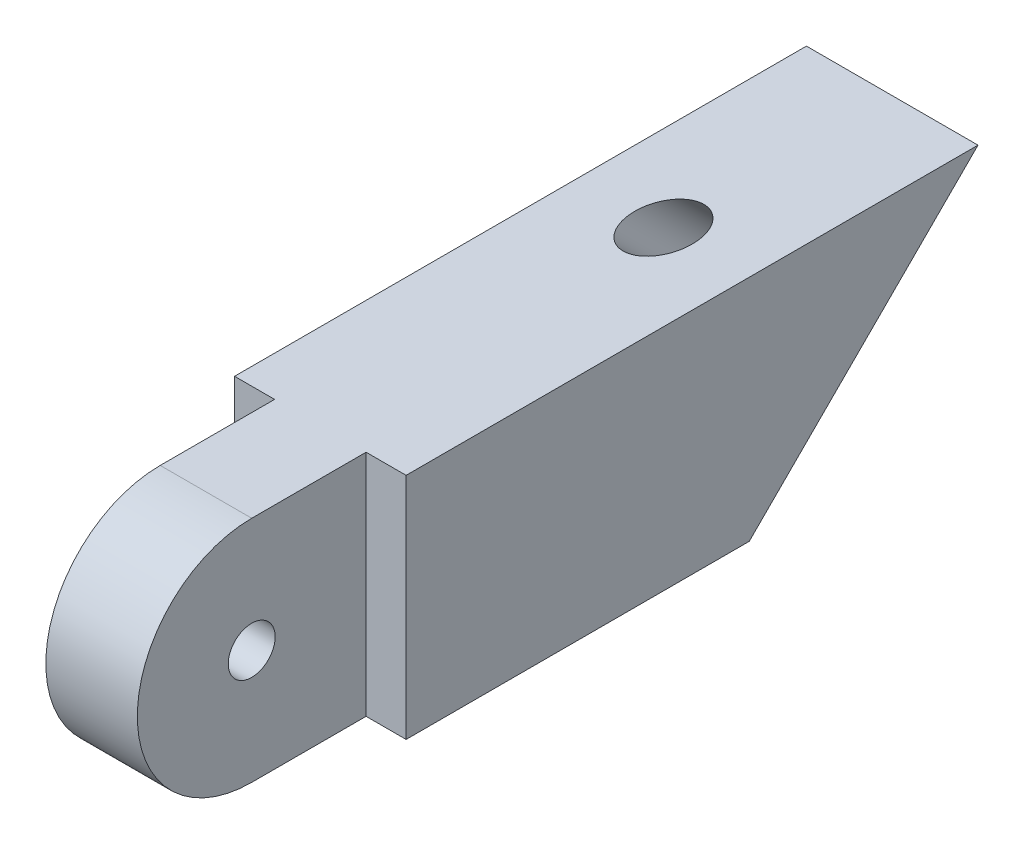
ISO-10303-21;
HEADER;
FILE_DESCRIPTION(('STEP AP214'),'2;1');
FILE_NAME('part.step','',(''),(''),'','','');
FILE_SCHEMA(('AUTOMOTIVE_DESIGN { 1 0 10303 214 1 1 1 1 }'));
ENDSEC;
DATA;
#1=APPLICATION_CONTEXT('core data for automotive mechanical design processes');
#2=APPLICATION_PROTOCOL_DEFINITION('international standard','automotive_design',2000,#1);
#3=PRODUCT_CONTEXT('',#1,'mechanical');
#4=PRODUCT('Part','Part','',(#3));
#5=PRODUCT_RELATED_PRODUCT_CATEGORY('part','',(#4));
#6=PRODUCT_DEFINITION_FORMATION('','',#4);
#7=PRODUCT_DEFINITION_CONTEXT('part definition',#1,'design');
#8=PRODUCT_DEFINITION('design','',#6,#7);
#9=PRODUCT_DEFINITION_SHAPE('','',#8);
#10=(LENGTH_UNIT() NAMED_UNIT(*) SI_UNIT(.MILLI.,.METRE.));
#11=(NAMED_UNIT(*) PLANE_ANGLE_UNIT() SI_UNIT($,.RADIAN.));
#12=(NAMED_UNIT(*) SI_UNIT($,.STERADIAN.) SOLID_ANGLE_UNIT());
#13=UNCERTAINTY_MEASURE_WITH_UNIT(LENGTH_MEASURE(1.E-05),#10,'distance_accuracy_value','');
#14=(GEOMETRIC_REPRESENTATION_CONTEXT(3) GLOBAL_UNCERTAINTY_ASSIGNED_CONTEXT((#13)) GLOBAL_UNIT_ASSIGNED_CONTEXT((#10,
#11,#12)) REPRESENTATION_CONTEXT('',''));
#15=CARTESIAN_POINT('',(0.,0.,0.));
#16=DIRECTION('',(0.,0.,1.));
#17=DIRECTION('',(1.,0.,0.));
#18=AXIS2_PLACEMENT_3D('',#15,#16,#17);
#19=CARTESIAN_POINT('',(30.,20.,70.));
#20=DIRECTION('',(0.,-1.,0.));
#21=DIRECTION('',(0.,0.,-1.));
#22=AXIS2_PLACEMENT_3D('',#19,#20,#21);
#23=PLANE('',#22);
#24=CARTESIAN_POINT('',(15.,20.,-30.));
#25=DIRECTION('',(0.,-1.,0.));
#26=DIRECTION('',(0.,0.,-1.));
#27=AXIS2_PLACEMENT_3D('',#24,#25,#26);
#28=ELLIPSE('',#27,7.07106781186544,5.);
#29=CARTESIAN_POINT('',(15.,20.,-37.0710678118654));
#30=VERTEX_POINT('',#29);
#31=EDGE_CURVE('E38',#30,#30,#28,.T.);
#32=ORIENTED_EDGE('',*,*,#31,.T.);
#33=EDGE_LOOP('',(#32));
#34=FACE_BOUND('',#33,.T.);
#35=DIRECTION('',(1.,0.,0.));
#36=VECTOR('',#35,1.);
#37=CARTESIAN_POINT('',(-22.,20.,50.));
#38=LINE('',#37,#36);
#39=CARTESIAN_POINT('',(6.99999999999999,20.,50.));
#40=VERTEX_POINT('',#39);
#41=CARTESIAN_POINT('',(23.,20.,50.));
#42=VERTEX_POINT('',#41);
#43=EDGE_CURVE('E159',#40,#42,#38,.T.);
#44=ORIENTED_EDGE('',*,*,#43,.T.);
#45=DIRECTION('',(0.,0.,1.));
#46=VECTOR('',#45,1.);
#47=CARTESIAN_POINT('',(23.,20.,30.));
#48=LINE('',#47,#46);
#49=CARTESIAN_POINT('',(23.,20.,30.));
#50=VERTEX_POINT('',#49);
#51=EDGE_CURVE('E127',#50,#42,#48,.T.);
#52=ORIENTED_EDGE('',*,*,#51,.F.);
#53=DIRECTION('',(-1.,0.,0.));
#54=VECTOR('',#53,1.);
#55=CARTESIAN_POINT('',(30.,20.,30.));
#56=LINE('',#55,#54);
#57=CARTESIAN_POINT('',(30.,20.,30.));
#58=VERTEX_POINT('',#57);
#59=EDGE_CURVE('E119',#58,#50,#56,.T.);
#60=ORIENTED_EDGE('',*,*,#59,.F.);
#61=DIRECTION('',(0.,0.,1.));
#62=VECTOR('',#61,1.);
#63=CARTESIAN_POINT('',(30.,20.,70.));
#64=LINE('',#63,#62);
#65=CARTESIAN_POINT('',(30.,20.,-70.));
#66=VERTEX_POINT('',#65);
#67=EDGE_CURVE('E111',#66,#58,#64,.T.);
#68=ORIENTED_EDGE('',*,*,#67,.F.);
#69=DIRECTION('',(-1.,0.,0.));
#70=VECTOR('',#69,1.);
#71=CARTESIAN_POINT('',(30.,20.,-70.));
#72=LINE('',#71,#70);
#73=CARTESIAN_POINT('',(0.,20.,-70.));
#74=VERTEX_POINT('',#73);
#75=EDGE_CURVE('E43',#66,#74,#72,.T.);
#76=ORIENTED_EDGE('',*,*,#75,.T.);
#77=DIRECTION('',(0.,0.,1.));
#78=VECTOR('',#77,1.);
#79=CARTESIAN_POINT('',(0.,20.,70.));
#80=LINE('',#79,#78);
#81=CARTESIAN_POINT('',(0.,20.,30.));
#82=VERTEX_POINT('',#81);
#83=EDGE_CURVE('E124',#74,#82,#80,.T.);
#84=ORIENTED_EDGE('',*,*,#83,.T.);
#85=DIRECTION('',(-1.,0.,0.));
#86=VECTOR('',#85,1.);
#87=CARTESIAN_POINT('',(0.,20.,30.));
#88=LINE('',#87,#86);
#89=CARTESIAN_POINT('',(7.,20.,30.));
#90=VERTEX_POINT('',#89);
#91=EDGE_CURVE('E136',#90,#82,#88,.T.);
#92=ORIENTED_EDGE('',*,*,#91,.F.);
#93=DIRECTION('',(0.,0.,1.));
#94=VECTOR('',#93,1.);
#95=CARTESIAN_POINT('',(7.,20.,30.));
#96=LINE('',#95,#94);
#97=EDGE_CURVE('E130',#90,#40,#96,.T.);
#98=ORIENTED_EDGE('',*,*,#97,.T.);
#99=EDGE_LOOP('',(#44,#52,#60,#68,#76,#84,#92,#98));
#100=FACE_BOUND('',#99,.T.);
#101=ADVANCED_FACE('F35',(#34,#100),#23,.F.);
#102=CARTESIAN_POINT('',(30.,0.,0.));
#103=DIRECTION('',(1.,0.,0.));
#104=DIRECTION('',(0.,0.,-1.));
#105=AXIS2_PLACEMENT_3D('',#102,#103,#104);
#106=PLANE('',#105);
#107=DIRECTION('',(0.,-0.707106781186544,0.707106781186551));
#108=VECTOR('',#107,1.);
#109=CARTESIAN_POINT('',(30.,20.,-70.));
#110=LINE('',#109,#108);
#111=CARTESIAN_POINT('',(30.,-20.,-29.9999999999996));
#112=VERTEX_POINT('',#111);
#113=EDGE_CURVE('E100',#66,#112,#110,.T.);
#114=ORIENTED_EDGE('',*,*,#113,.F.);
#115=ORIENTED_EDGE('',*,*,#67,.T.);
#116=DIRECTION('',(0.,1.,0.));
#117=VECTOR('',#116,1.);
#118=CARTESIAN_POINT('',(30.,-20.,30.));
#119=LINE('',#118,#117);
#120=CARTESIAN_POINT('',(30.,-20.,30.));
#121=VERTEX_POINT('',#120);
#122=EDGE_CURVE('E141',#121,#58,#119,.T.);
#123=ORIENTED_EDGE('',*,*,#122,.F.);
#124=DIRECTION('',(0.,0.,-1.));
#125=VECTOR('',#124,1.);
#126=CARTESIAN_POINT('',(30.,-20.,70.));
#127=LINE('',#126,#125);
#128=EDGE_CURVE('E105',#121,#112,#127,.T.);
#129=ORIENTED_EDGE('',*,*,#128,.T.);
#130=EDGE_LOOP('',(#114,#115,#123,#129));
#131=FACE_BOUND('',#130,.T.);
#132=ADVANCED_FACE('F110',(#131),#106,.T.);
#133=CARTESIAN_POINT('',(30.,-20.,70.));
#134=DIRECTION('',(0.,1.,0.));
#135=DIRECTION('',(0.,0.,1.));
#136=AXIS2_PLACEMENT_3D('',#133,#134,#135);
#137=PLANE('',#136);
#138=DIRECTION('',(0.,0.,-1.));
#139=VECTOR('',#138,1.);
#140=CARTESIAN_POINT('',(0.,-20.,70.));
#141=LINE('',#140,#139);
#142=CARTESIAN_POINT('',(0.,-20.,30.));
#143=VERTEX_POINT('',#142);
#144=CARTESIAN_POINT('',(0.,-20.,-29.9999999999996));
#145=VERTEX_POINT('',#144);
#146=EDGE_CURVE('E120',#143,#145,#141,.T.);
#147=ORIENTED_EDGE('',*,*,#146,.T.);
#148=DIRECTION('',(1.,0.,0.));
#149=VECTOR('',#148,1.);
#150=CARTESIAN_POINT('',(-15.,-20.,-29.9999999999996));
#151=LINE('',#150,#149);
#152=EDGE_CURVE('E50',#145,#112,#151,.T.);
#153=ORIENTED_EDGE('',*,*,#152,.T.);
#154=ORIENTED_EDGE('',*,*,#128,.F.);
#155=DIRECTION('',(1.,0.,0.));
#156=VECTOR('',#155,1.);
#157=CARTESIAN_POINT('',(23.,-20.,30.));
#158=LINE('',#157,#156);
#159=CARTESIAN_POINT('',(23.,-20.,30.));
#160=VERTEX_POINT('',#159);
#161=EDGE_CURVE('E57',#160,#121,#158,.T.);
#162=ORIENTED_EDGE('',*,*,#161,.F.);
#163=DIRECTION('',(0.,0.,1.));
#164=VECTOR('',#163,1.);
#165=CARTESIAN_POINT('',(23.,-20.,30.));
#166=LINE('',#165,#164);
#167=CARTESIAN_POINT('',(23.,-20.,50.));
#168=VERTEX_POINT('',#167);
#169=EDGE_CURVE('E147',#160,#168,#166,.T.);
#170=ORIENTED_EDGE('',*,*,#169,.T.);
#171=DIRECTION('',(1.,0.,0.));
#172=VECTOR('',#171,1.);
#173=CARTESIAN_POINT('',(-22.,-20.,50.));
#174=LINE('',#173,#172);
#175=CARTESIAN_POINT('',(7.,-20.,50.));
#176=VERTEX_POINT('',#175);
#177=EDGE_CURVE('E164',#176,#168,#174,.T.);
#178=ORIENTED_EDGE('',*,*,#177,.F.);
#179=DIRECTION('',(0.,0.,1.));
#180=VECTOR('',#179,1.);
#181=CARTESIAN_POINT('',(7.,-20.,30.));
#182=LINE('',#181,#180);
#183=CARTESIAN_POINT('',(7.,-20.,30.));
#184=VERTEX_POINT('',#183);
#185=EDGE_CURVE('E133',#184,#176,#182,.T.);
#186=ORIENTED_EDGE('',*,*,#185,.F.);
#187=DIRECTION('',(1.,0.,0.));
#188=VECTOR('',#187,1.);
#189=CARTESIAN_POINT('',(7.,-20.,30.));
#190=LINE('',#189,#188);
#191=EDGE_CURVE('E152',#143,#184,#190,.T.);
#192=ORIENTED_EDGE('',*,*,#191,.F.);
#193=EDGE_LOOP('',(#147,#153,#154,#162,#170,#178,#186,#192));
#194=FACE_BOUND('',#193,.T.);
#195=ADVANCED_FACE('F178',(#194),#137,.F.);
#196=CARTESIAN_POINT('',(0.,0.,0.));
#197=DIRECTION('',(1.,0.,0.));
#198=DIRECTION('',(0.,0.,-1.));
#199=AXIS2_PLACEMENT_3D('',#196,#197,#198);
#200=PLANE('',#199);
#201=ORIENTED_EDGE('',*,*,#83,.F.);
#202=DIRECTION('',(0.,-0.707106781186544,0.707106781186551));
#203=VECTOR('',#202,1.);
#204=CARTESIAN_POINT('',(0.,-24.9999999999999,-24.9999999999996));
#205=LINE('',#204,#203);
#206=EDGE_CURVE('E11',#74,#145,#205,.T.);
#207=ORIENTED_EDGE('',*,*,#206,.T.);
#208=ORIENTED_EDGE('',*,*,#146,.F.);
#209=DIRECTION('',(0.,-1.,0.));
#210=VECTOR('',#209,1.);
#211=CARTESIAN_POINT('',(0.,-20.,30.));
#212=LINE('',#211,#210);
#213=EDGE_CURVE('E149',#82,#143,#212,.T.);
#214=ORIENTED_EDGE('',*,*,#213,.F.);
#215=EDGE_LOOP('',(#201,#207,#208,#214));
#216=FACE_BOUND('',#215,.T.);
#217=ADVANCED_FACE('F177',(#216),#200,.F.);
#218=CARTESIAN_POINT('',(7.,20.,30.));
#219=DIRECTION('',(1.,0.,0.));
#220=DIRECTION('',(0.,1.,0.));
#221=AXIS2_PLACEMENT_3D('',#218,#219,#220);
#222=PLANE('',#221);
#223=CARTESIAN_POINT('',(7.,0.,50.));
#224=DIRECTION('',(1.,0.,0.));
#225=DIRECTION('',(0.,1.,0.));
#226=AXIS2_PLACEMENT_3D('',#223,#224,#225);
#227=CIRCLE('',#226,4.1);
#228=CARTESIAN_POINT('',(7.,4.1,50.));
#229=VERTEX_POINT('',#228);
#230=EDGE_CURVE('E183',#229,#229,#227,.T.);
#231=ORIENTED_EDGE('',*,*,#230,.T.);
#232=EDGE_LOOP('',(#231));
#233=FACE_BOUND('',#232,.T.);
#234=ORIENTED_EDGE('',*,*,#185,.T.);
#235=CARTESIAN_POINT('',(7.,0.,50.));
#236=DIRECTION('',(1.,0.,0.));
#237=DIRECTION('',(0.,1.,0.));
#238=AXIS2_PLACEMENT_3D('',#235,#236,#237);
#239=CIRCLE('',#238,20.);
#240=EDGE_CURVE('E143',#176,#40,#239,.F.);
#241=ORIENTED_EDGE('',*,*,#240,.T.);
#242=ORIENTED_EDGE('',*,*,#97,.F.);
#243=DIRECTION('',(0.,1.,0.));
#244=VECTOR('',#243,1.);
#245=CARTESIAN_POINT('',(7.,20.,30.));
#246=LINE('',#245,#244);
#247=EDGE_CURVE('E169',#184,#90,#246,.T.);
#248=ORIENTED_EDGE('',*,*,#247,.F.);
#249=EDGE_LOOP('',(#234,#241,#242,#248));
#250=FACE_BOUND('',#249,.T.);
#251=ADVANCED_FACE('F181',(#233,#250),#222,.F.);
#252=CARTESIAN_POINT('',(0.,0.,30.));
#253=DIRECTION('',(0.,0.,-1.));
#254=DIRECTION('',(-1.,0.,0.));
#255=AXIS2_PLACEMENT_3D('',#252,#253,#254);
#256=PLANE('',#255);
#257=ORIENTED_EDGE('',*,*,#213,.T.);
#258=ORIENTED_EDGE('',*,*,#191,.T.);
#259=ORIENTED_EDGE('',*,*,#247,.T.);
#260=ORIENTED_EDGE('',*,*,#91,.T.);
#261=EDGE_LOOP('',(#257,#258,#259,#260));
#262=FACE_BOUND('',#261,.T.);
#263=ADVANCED_FACE('F173',(#262),#256,.F.);
#264=CARTESIAN_POINT('',(23.,20.,30.));
#265=DIRECTION('',(-1.,0.,0.));
#266=DIRECTION('',(0.,-1.,0.));
#267=AXIS2_PLACEMENT_3D('',#264,#265,#266);
#268=PLANE('',#267);
#269=CARTESIAN_POINT('',(23.,0.,50.));
#270=DIRECTION('',(1.,0.,0.));
#271=DIRECTION('',(0.,1.,0.));
#272=AXIS2_PLACEMENT_3D('',#269,#270,#271);
#273=CIRCLE('',#272,4.1);
#274=CARTESIAN_POINT('',(23.,4.1,50.));
#275=VERTEX_POINT('',#274);
#276=EDGE_CURVE('E185',#275,#275,#273,.T.);
#277=ORIENTED_EDGE('',*,*,#276,.F.);
#278=EDGE_LOOP('',(#277));
#279=FACE_BOUND('',#278,.T.);
#280=CARTESIAN_POINT('',(23.,0.,50.));
#281=DIRECTION('',(-1.,0.,0.));
#282=DIRECTION('',(0.,-1.,0.));
#283=AXIS2_PLACEMENT_3D('',#280,#281,#282);
#284=CIRCLE('',#283,20.);
#285=EDGE_CURVE('E157',#168,#42,#284,.T.);
#286=ORIENTED_EDGE('',*,*,#285,.F.);
#287=ORIENTED_EDGE('',*,*,#169,.F.);
#288=DIRECTION('',(0.,-1.,0.));
#289=VECTOR('',#288,1.);
#290=CARTESIAN_POINT('',(23.,20.,30.));
#291=LINE('',#290,#289);
#292=EDGE_CURVE('E145',#50,#160,#291,.T.);
#293=ORIENTED_EDGE('',*,*,#292,.F.);
#294=ORIENTED_EDGE('',*,*,#51,.T.);
#295=EDGE_LOOP('',(#286,#287,#293,#294));
#296=FACE_BOUND('',#295,.T.);
#297=ADVANCED_FACE('F156',(#279,#296),#268,.F.);
#298=CARTESIAN_POINT('',(0.,0.,30.));
#299=DIRECTION('',(0.,0.,1.));
#300=DIRECTION('',(1.,0.,0.));
#301=AXIS2_PLACEMENT_3D('',#298,#299,#300);
#302=PLANE('',#301);
#303=ORIENTED_EDGE('',*,*,#122,.T.);
#304=ORIENTED_EDGE('',*,*,#59,.T.);
#305=ORIENTED_EDGE('',*,*,#292,.T.);
#306=ORIENTED_EDGE('',*,*,#161,.T.);
#307=EDGE_LOOP('',(#303,#304,#305,#306));
#308=FACE_BOUND('',#307,.T.);
#309=ADVANCED_FACE('F236',(#308),#302,.T.);
#310=CARTESIAN_POINT('',(-22.,0.,50.));
#311=DIRECTION('',(1.,0.,0.));
#312=DIRECTION('',(0.,1.,0.));
#313=AXIS2_PLACEMENT_3D('',#310,#311,#312);
#314=CYLINDRICAL_SURFACE('',#313,20.);
#315=ORIENTED_EDGE('',*,*,#240,.F.);
#316=ORIENTED_EDGE('',*,*,#177,.T.);
#317=ORIENTED_EDGE('',*,*,#285,.T.);
#318=ORIENTED_EDGE('',*,*,#43,.F.);
#319=EDGE_LOOP('',(#315,#316,#317,#318));
#320=FACE_BOUND('',#319,.T.);
#321=ADVANCED_FACE('F182',(#320),#314,.T.);
#322=CARTESIAN_POINT('',(-22.,0.,50.));
#323=DIRECTION('',(1.,0.,0.));
#324=DIRECTION('',(0.,1.,0.));
#325=AXIS2_PLACEMENT_3D('',#322,#323,#324);
#326=CYLINDRICAL_SURFACE('',#325,4.1);
#327=CARTESIAN_POINT('',(23.,4.1,50.));
#328=CARTESIAN_POINT('',(22.8333333333333,4.1,50.));
#329=CARTESIAN_POINT('',(22.6666666666667,4.1,50.));
#330=CARTESIAN_POINT('',(22.3333333333333,4.1,50.));
#331=CARTESIAN_POINT('',(22.1666666666667,4.1,50.));
#332=CARTESIAN_POINT('',(21.8333333333333,4.1,50.));
#333=CARTESIAN_POINT('',(21.6666666666667,4.1,50.));
#334=CARTESIAN_POINT('',(21.3333333333333,4.1,50.));
#335=CARTESIAN_POINT('',(21.1666666666667,4.1,50.));
#336=CARTESIAN_POINT('',(20.8333333333333,4.1,50.));
#337=CARTESIAN_POINT('',(20.6666666666667,4.1,50.));
#338=CARTESIAN_POINT('',(20.3333333333333,4.1,50.));
#339=CARTESIAN_POINT('',(20.1666666666667,4.1,50.));
#340=CARTESIAN_POINT('',(19.8333333333333,4.1,50.));
#341=CARTESIAN_POINT('',(19.6666666666667,4.1,50.));
#342=CARTESIAN_POINT('',(19.3333333333333,4.1,50.));
#343=CARTESIAN_POINT('',(19.1666666666667,4.1,50.));
#344=CARTESIAN_POINT('',(18.8333333333333,4.1,50.));
#345=CARTESIAN_POINT('',(18.6666666666667,4.1,50.));
#346=CARTESIAN_POINT('',(18.3333333333333,4.1,50.));
#347=CARTESIAN_POINT('',(18.1666666666667,4.1,50.));
#348=CARTESIAN_POINT('',(17.8333333333333,4.1,50.));
#349=CARTESIAN_POINT('',(17.6666666666667,4.1,50.));
#350=CARTESIAN_POINT('',(17.3333333333333,4.1,50.));
#351=CARTESIAN_POINT('',(17.1666666666667,4.1,50.));
#352=CARTESIAN_POINT('',(16.8333333333333,4.1,50.));
#353=CARTESIAN_POINT('',(16.6666666666667,4.1,50.));
#354=CARTESIAN_POINT('',(16.3333333333333,4.1,50.));
#355=CARTESIAN_POINT('',(16.1666666666667,4.1,50.));
#356=CARTESIAN_POINT('',(15.8333333333333,4.1,50.));
#357=CARTESIAN_POINT('',(15.6666666666667,4.1,50.));
#358=CARTESIAN_POINT('',(15.3333333333333,4.1,50.));
#359=CARTESIAN_POINT('',(15.1666666666667,4.1,50.));
#360=CARTESIAN_POINT('',(14.8333333333333,4.1,50.));
#361=CARTESIAN_POINT('',(14.6666666666667,4.1,50.));
#362=CARTESIAN_POINT('',(14.3333333333333,4.1,50.));
#363=CARTESIAN_POINT('',(14.1666666666667,4.1,50.));
#364=CARTESIAN_POINT('',(13.8333333333333,4.1,50.));
#365=CARTESIAN_POINT('',(13.6666666666667,4.1,50.));
#366=CARTESIAN_POINT('',(13.3333333333333,4.1,50.));
#367=CARTESIAN_POINT('',(13.1666666666667,4.1,50.));
#368=CARTESIAN_POINT('',(12.8333333333333,4.1,50.));
#369=CARTESIAN_POINT('',(12.6666666666667,4.1,50.));
#370=CARTESIAN_POINT('',(12.3333333333333,4.1,50.));
#371=CARTESIAN_POINT('',(12.1666666666667,4.1,50.));
#372=CARTESIAN_POINT('',(11.8333333333333,4.1,50.));
#373=CARTESIAN_POINT('',(11.6666666666667,4.1,50.));
#374=CARTESIAN_POINT('',(11.3333333333333,4.1,50.));
#375=CARTESIAN_POINT('',(11.1666666666667,4.1,50.));
#376=CARTESIAN_POINT('',(10.8333333333333,4.1,50.));
#377=CARTESIAN_POINT('',(10.6666666666667,4.1,50.));
#378=CARTESIAN_POINT('',(10.3333333333333,4.1,50.));
#379=CARTESIAN_POINT('',(10.1666666666667,4.1,50.));
#380=CARTESIAN_POINT('',(9.83333333333333,4.1,50.));
#381=CARTESIAN_POINT('',(9.66666666666667,4.1,50.));
#382=CARTESIAN_POINT('',(9.33333333333333,4.1,50.));
#383=CARTESIAN_POINT('',(9.16666666666667,4.1,50.));
#384=CARTESIAN_POINT('',(8.83333333333333,4.1,50.));
#385=CARTESIAN_POINT('',(8.66666666666667,4.1,50.));
#386=CARTESIAN_POINT('',(8.33333333333333,4.1,50.));
#387=CARTESIAN_POINT('',(8.16666666666667,4.1,50.));
#388=CARTESIAN_POINT('',(7.83333333333333,4.1,50.));
#389=CARTESIAN_POINT('',(7.66666666666667,4.1,50.));
#390=CARTESIAN_POINT('',(7.33333333333333,4.1,50.));
#391=CARTESIAN_POINT('',(7.16666666666667,4.1,50.));
#392=CARTESIAN_POINT('',(7.,4.1,50.));
#393=B_SPLINE_CURVE_WITH_KNOTS('',3,(#327,#328,#329,#330,#331,#332,#333,#334,#335,#336,#337,
#338,#339,#340,#341,#342,#343,#344,#345,#346,#347,#348,#349,#350,#351,#352,#353,#354,#355,#356,
#357,#358,#359,#360,#361,#362,#363,#364,#365,#366,#367,#368,#369,#370,#371,#372,#373,#374,#375,
#376,#377,#378,#379,#380,#381,#382,#383,#384,#385,#386,#387,#388,#389,#390,#391,#392),
.UNSPECIFIED.,.F.,.F.,(4,2,2,2,2,2,2,2,2,2,2,2,2,2,2,2,2,2,2,2,2,2,2,2,2,2,2,2,2,2,2,2,4),(0.,
0.5,1.,1.5,2.,2.5,3.,3.5,4.,4.5,5.,5.50000000000001,6.00000000000001,6.50000000000001,
7.00000000000001,7.50000000000001,8.00000000000001,8.50000000000001,9.00000000000001,
9.50000000000001,10.,10.5,11.,11.5,12.,12.5,13.,13.5,14.,14.5,15.,15.5,16.),.UNSPECIFIED.);
#394=EDGE_CURVE('BSEAM242',#275,#229,#393,.T.);
#395=ORIENTED_EDGE('',*,*,#276,.T.);
#396=ORIENTED_EDGE('',*,*,#230,.F.);
#397=ORIENTED_EDGE('',*,*,#394,.T.);
#398=ORIENTED_EDGE('',*,*,#394,.F.);
#399=EDGE_LOOP('',(#395,#397,#396,#398));
#400=FACE_BOUND('',#399,.T.);
#401=ADVANCED_FACE('F242',(#400),#326,.F.);
#402=CARTESIAN_POINT('',(-15.,20.,-70.));
#403=DIRECTION('',(0.,0.707106781186551,0.707106781186544));
#404=DIRECTION('',(0.,-0.707106781186544,0.707106781186551));
#405=AXIS2_PLACEMENT_3D('',#402,#403,#404);
#406=PLANE('',#405);
#407=CARTESIAN_POINT('',(15.,0.,-49.9999999999998));
#408=DIRECTION('',(0.,-0.707106781186551,-0.707106781186544));
#409=DIRECTION('',(0.,0.707106781186544,-0.707106781186551));
#410=AXIS2_PLACEMENT_3D('',#407,#408,#409);
#411=CIRCLE('',#410,10.);
#412=CARTESIAN_POINT('',(15.,7.07106781186544,-57.0710678118653));
#413=VERTEX_POINT('',#412);
#414=EDGE_CURVE('E191',#413,#413,#411,.T.);
#415=ORIENTED_EDGE('',*,*,#414,.F.);
#416=EDGE_LOOP('',(#415));
#417=FACE_BOUND('',#416,.T.);
#418=ORIENTED_EDGE('',*,*,#75,.F.);
#419=ORIENTED_EDGE('',*,*,#113,.T.);
#420=ORIENTED_EDGE('',*,*,#152,.F.);
#421=ORIENTED_EDGE('',*,*,#206,.F.);
#422=EDGE_LOOP('',(#418,#419,#420,#421));
#423=FACE_BOUND('',#422,.T.);
#424=ADVANCED_FACE('F99',(#417,#423),#406,.F.);
#425=CARTESIAN_POINT('',(15.,7.07106781186551,-42.9289321881343));
#426=DIRECTION('',(0.,-0.707106781186551,-0.707106781186544));
#427=DIRECTION('',(0.,0.707106781186544,-0.707106781186551));
#428=AXIS2_PLACEMENT_3D('',#425,#426,#427);
#429=CYLINDRICAL_SURFACE('',#428,10.);
#430=CARTESIAN_POINT('',(15.,7.07106781186551,-42.9289321881343));
#431=DIRECTION('',(0.,-0.707106781186551,-0.707106781186544));
#432=DIRECTION('',(0.,0.707106781186544,-0.707106781186551));
#433=AXIS2_PLACEMENT_3D('',#430,#431,#432);
#434=CIRCLE('',#433,10.);
#435=CARTESIAN_POINT('',(15.,14.1421356237309,-49.9999999999998));
#436=VERTEX_POINT('',#435);
#437=EDGE_CURVE('E113',#436,#436,#434,.T.);
#438=ORIENTED_EDGE('',*,*,#437,.F.);
#439=EDGE_LOOP('',(#438));
#440=FACE_BOUND('',#439,.T.);
#441=ORIENTED_EDGE('',*,*,#414,.T.);
#442=EDGE_LOOP('',(#441));
#443=FACE_BOUND('',#442,.T.);
#444=ADVANCED_FACE('F211',(#440,#443),#429,.F.);
#445=CARTESIAN_POINT('',(15.,7.07106781186551,-42.9289321881343));
#446=DIRECTION('',(0.,-0.707106781186551,-0.707106781186544));
#447=DIRECTION('',(0.,0.707106781186544,-0.707106781186551));
#448=AXIS2_PLACEMENT_3D('',#445,#446,#447);
#449=PLANE('',#448);
#450=CARTESIAN_POINT('',(15.,7.07106781186551,-42.9289321881343));
#451=DIRECTION('',(0.,-0.707106781186551,-0.707106781186544));
#452=DIRECTION('',(0.,0.707106781186544,-0.707106781186551));
#453=AXIS2_PLACEMENT_3D('',#450,#451,#452);
#454=CIRCLE('',#453,5.);
#455=CARTESIAN_POINT('',(15.,10.6066017177982,-46.4644660940671));
#456=VERTEX_POINT('',#455);
#457=EDGE_CURVE('E196',#456,#456,#454,.T.);
#458=ORIENTED_EDGE('',*,*,#457,.F.);
#459=EDGE_LOOP('',(#458));
#460=FACE_BOUND('',#459,.T.);
#461=ORIENTED_EDGE('',*,*,#437,.T.);
#462=EDGE_LOOP('',(#461));
#463=FACE_BOUND('',#462,.T.);
#464=ADVANCED_FACE('F206',(#460,#463),#449,.T.);
#465=CARTESIAN_POINT('',(15.,31.8198051533948,-18.1801948466053));
#466=DIRECTION('',(0.,-0.707106781186551,-0.707106781186544));
#467=DIRECTION('',(0.,0.707106781186544,-0.707106781186551));
#468=AXIS2_PLACEMENT_3D('',#465,#466,#467);
#469=CYLINDRICAL_SURFACE('',#468,5.);
#470=ORIENTED_EDGE('',*,*,#457,.T.);
#471=EDGE_LOOP('',(#470));
#472=FACE_BOUND('',#471,.T.);
#473=ORIENTED_EDGE('',*,*,#31,.F.);
#474=EDGE_LOOP('',(#473));
#475=FACE_BOUND('',#474,.T.);
#476=ADVANCED_FACE('F204',(#472,#475),#469,.F.);
#477=CLOSED_SHELL('',(#101,#132,#195,#217,#251,#263,#297,#309,#321,#401,#424,#444,#464,#476));
#478=MANIFOLD_SOLID_BREP('B2',#477);
#479=ADVANCED_BREP_SHAPE_REPRESENTATION('',(#18,#478),#14);
#480=SHAPE_DEFINITION_REPRESENTATION(#9,#479);
ENDSEC;
END-ISO-10303-21;
